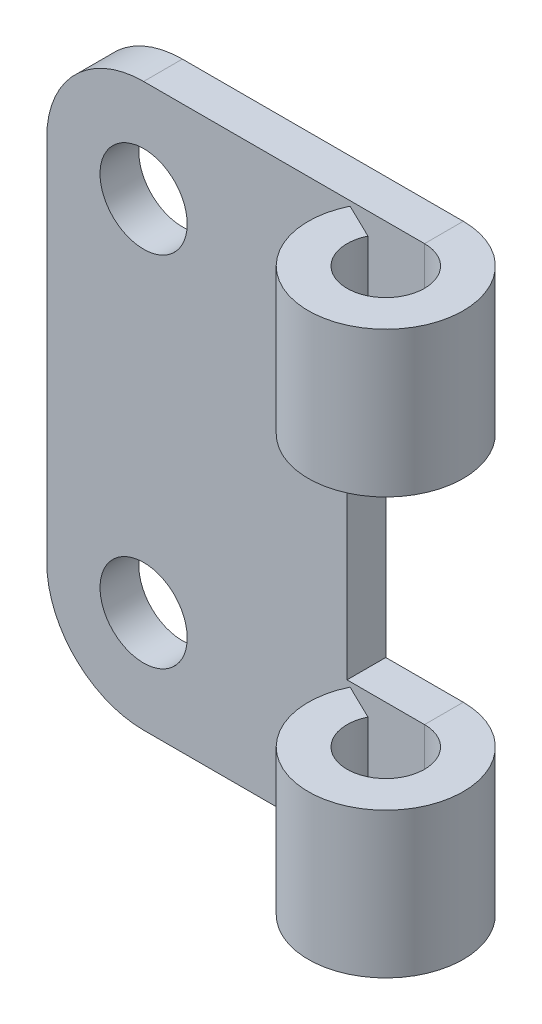
ISO-10303-21;
HEADER;
FILE_DESCRIPTION(('STEP AP214'),'2;1');
FILE_NAME('part.step','',(''),(''),'','','');
FILE_SCHEMA(('AUTOMOTIVE_DESIGN { 1 0 10303 214 1 1 1 1 }'));
ENDSEC;
DATA;
#1=APPLICATION_CONTEXT('core data for automotive mechanical design processes');
#2=APPLICATION_PROTOCOL_DEFINITION('international standard','automotive_design',2000,#1);
#3=PRODUCT_CONTEXT('',#1,'mechanical');
#4=PRODUCT('Part','Part','',(#3));
#5=PRODUCT_RELATED_PRODUCT_CATEGORY('part','',(#4));
#6=PRODUCT_DEFINITION_FORMATION('','',#4);
#7=PRODUCT_DEFINITION_CONTEXT('part definition',#1,'design');
#8=PRODUCT_DEFINITION('design','',#6,#7);
#9=PRODUCT_DEFINITION_SHAPE('','',#8);
#10=(LENGTH_UNIT() NAMED_UNIT(*) SI_UNIT(.MILLI.,.METRE.));
#11=(NAMED_UNIT(*) PLANE_ANGLE_UNIT() SI_UNIT($,.RADIAN.));
#12=(NAMED_UNIT(*) SI_UNIT($,.STERADIAN.) SOLID_ANGLE_UNIT());
#13=UNCERTAINTY_MEASURE_WITH_UNIT(LENGTH_MEASURE(1.E-05),#10,'distance_accuracy_value','');
#14=(GEOMETRIC_REPRESENTATION_CONTEXT(3) GLOBAL_UNCERTAINTY_ASSIGNED_CONTEXT((#13)) GLOBAL_UNIT_ASSIGNED_CONTEXT((#10,
#11,#12)) REPRESENTATION_CONTEXT('',''));
#15=CARTESIAN_POINT('',(0.,0.,0.));
#16=DIRECTION('',(0.,0.,1.));
#17=DIRECTION('',(1.,0.,0.));
#18=AXIS2_PLACEMENT_3D('',#15,#16,#17);
#19=CARTESIAN_POINT('',(-19.5,-29.,-4.));
#20=DIRECTION('',(0.,-1.,0.));
#21=DIRECTION('',(0.,0.,-1.));
#22=AXIS2_PLACEMENT_3D('',#19,#20,#21);
#23=PLANE('',#22);
#24=DIRECTION('',(1.,0.,0.));
#25=VECTOR('',#24,1.);
#26=CARTESIAN_POINT('',(-19.5,-29.,0.));
#27=LINE('',#26,#25);
#28=CARTESIAN_POINT('',(-9.50000000000001,-29.,0.));
#29=VERTEX_POINT('',#28);
#30=CARTESIAN_POINT('',(19.5,-29.,0.));
#31=VERTEX_POINT('',#30);
#32=EDGE_CURVE('E204',#29,#31,#27,.T.);
#33=ORIENTED_EDGE('',*,*,#32,.F.);
#34=DIRECTION('',(0.,0.,1.));
#35=VECTOR('',#34,1.);
#36=CARTESIAN_POINT('',(-9.50000000000001,-29.,-4.));
#37=LINE('',#36,#35);
#38=CARTESIAN_POINT('',(-9.50000000000001,-29.,-4.));
#39=VERTEX_POINT('',#38);
#40=EDGE_CURVE('E59',#29,#39,#37,.F.);
#41=ORIENTED_EDGE('',*,*,#40,.T.);
#42=DIRECTION('',(1.,0.,0.));
#43=VECTOR('',#42,1.);
#44=CARTESIAN_POINT('',(-19.5,-29.,-4.));
#45=LINE('',#44,#43);
#46=CARTESIAN_POINT('',(19.5,-29.,-4.));
#47=VERTEX_POINT('',#46);
#48=EDGE_CURVE('E221',#39,#47,#45,.T.);
#49=ORIENTED_EDGE('',*,*,#48,.T.);
#50=DIRECTION('',(0.,0.,1.));
#51=VECTOR('',#50,1.);
#52=CARTESIAN_POINT('',(19.5,-29.,-4.));
#53=LINE('',#52,#51);
#54=EDGE_CURVE('E165',#47,#31,#53,.T.);
#55=ORIENTED_EDGE('',*,*,#54,.T.);
#56=EDGE_LOOP('',(#33,#41,#49,#55));
#57=FACE_BOUND('',#56,.T.);
#58=ADVANCED_FACE('F36',(#57),#23,.T.);
#59=CARTESIAN_POINT('',(-19.5,29.,-4.));
#60=DIRECTION('',(-1.,0.,0.));
#61=DIRECTION('',(0.,-1.,0.));
#62=AXIS2_PLACEMENT_3D('',#59,#60,#61);
#63=PLANE('',#62);
#64=DIRECTION('',(0.,-1.,0.));
#65=VECTOR('',#64,1.);
#66=CARTESIAN_POINT('',(-19.5,29.,-4.));
#67=LINE('',#66,#65);
#68=CARTESIAN_POINT('',(-19.5,19.,-4.));
#69=VERTEX_POINT('',#68);
#70=CARTESIAN_POINT('',(-19.5,-19.,-4.));
#71=VERTEX_POINT('',#70);
#72=EDGE_CURVE('E218',#69,#71,#67,.T.);
#73=ORIENTED_EDGE('',*,*,#72,.T.);
#74=DIRECTION('',(0.,0.,1.));
#75=VECTOR('',#74,1.);
#76=CARTESIAN_POINT('',(-19.5,-19.,-4.));
#77=LINE('',#76,#75);
#78=CARTESIAN_POINT('',(-19.5,-19.,0.));
#79=VERTEX_POINT('',#78);
#80=EDGE_CURVE('E257',#71,#79,#77,.T.);
#81=ORIENTED_EDGE('',*,*,#80,.T.);
#82=DIRECTION('',(0.,-1.,0.));
#83=VECTOR('',#82,1.);
#84=CARTESIAN_POINT('',(-19.5,29.,0.));
#85=LINE('',#84,#83);
#86=CARTESIAN_POINT('',(-19.5,19.,0.));
#87=VERTEX_POINT('',#86);
#88=EDGE_CURVE('E239',#87,#79,#85,.T.);
#89=ORIENTED_EDGE('',*,*,#88,.F.);
#90=DIRECTION('',(0.,0.,1.));
#91=VECTOR('',#90,1.);
#92=CARTESIAN_POINT('',(-19.5,19.,-4.));
#93=LINE('',#92,#91);
#94=EDGE_CURVE('E244',#87,#69,#93,.F.);
#95=ORIENTED_EDGE('',*,*,#94,.T.);
#96=EDGE_LOOP('',(#73,#81,#89,#95));
#97=FACE_BOUND('',#96,.T.);
#98=ADVANCED_FACE('F271',(#97),#63,.T.);
#99=CARTESIAN_POINT('',(-19.5,29.,-4.));
#100=DIRECTION('',(0.,1.,0.));
#101=DIRECTION('',(0.,0.,1.));
#102=AXIS2_PLACEMENT_3D('',#99,#100,#101);
#103=PLANE('',#102);
#104=DIRECTION('',(-1.,0.,0.));
#105=VECTOR('',#104,1.);
#106=CARTESIAN_POINT('',(-19.5,29.,-4.));
#107=LINE('',#106,#105);
#108=CARTESIAN_POINT('',(19.5,29.,-4.));
#109=VERTEX_POINT('',#108);
#110=CARTESIAN_POINT('',(-9.50000000000001,29.,-4.));
#111=VERTEX_POINT('',#110);
#112=EDGE_CURVE('E216',#109,#111,#107,.T.);
#113=ORIENTED_EDGE('',*,*,#112,.T.);
#114=DIRECTION('',(0.,0.,1.));
#115=VECTOR('',#114,1.);
#116=CARTESIAN_POINT('',(-9.50000000000001,29.,-4.));
#117=LINE('',#116,#115);
#118=CARTESIAN_POINT('',(-9.50000000000001,29.,0.));
#119=VERTEX_POINT('',#118);
#120=EDGE_CURVE('E11',#111,#119,#117,.T.);
#121=ORIENTED_EDGE('',*,*,#120,.T.);
#122=DIRECTION('',(-1.,0.,0.));
#123=VECTOR('',#122,1.);
#124=CARTESIAN_POINT('',(-19.5,29.,0.));
#125=LINE('',#124,#123);
#126=CARTESIAN_POINT('',(19.5,29.,0.));
#127=VERTEX_POINT('',#126);
#128=EDGE_CURVE('E236',#127,#119,#125,.T.);
#129=ORIENTED_EDGE('',*,*,#128,.F.);
#130=DIRECTION('',(0.,0.,1.));
#131=VECTOR('',#130,1.);
#132=CARTESIAN_POINT('',(19.5,29.,-4.));
#133=LINE('',#132,#131);
#134=EDGE_CURVE('E245',#109,#127,#133,.T.);
#135=ORIENTED_EDGE('',*,*,#134,.F.);
#136=EDGE_LOOP('',(#113,#121,#129,#135));
#137=FACE_BOUND('',#136,.T.);
#138=ADVANCED_FACE('F303',(#137),#103,.T.);
#139=CARTESIAN_POINT('',(19.5,14.,-4.));
#140=DIRECTION('',(0.,-1.,0.));
#141=DIRECTION('',(0.,0.,-1.));
#142=AXIS2_PLACEMENT_3D('',#139,#140,#141);
#143=PLANE('',#142);
#144=DIRECTION('',(1.,0.,0.));
#145=VECTOR('',#144,1.);
#146=CARTESIAN_POINT('',(19.5,14.,0.));
#147=LINE('',#146,#145);
#148=CARTESIAN_POINT('',(11.5,14.,0.));
#149=VERTEX_POINT('',#148);
#150=CARTESIAN_POINT('',(19.5,14.,0.));
#151=VERTEX_POINT('',#150);
#152=EDGE_CURVE('E231',#149,#151,#147,.T.);
#153=ORIENTED_EDGE('',*,*,#152,.F.);
#154=DIRECTION('',(0.,0.,1.));
#155=VECTOR('',#154,1.);
#156=CARTESIAN_POINT('',(11.5,14.,-4.));
#157=LINE('',#156,#155);
#158=CARTESIAN_POINT('',(11.5,14.,-4.));
#159=VERTEX_POINT('',#158);
#160=EDGE_CURVE('E250',#159,#149,#157,.T.);
#161=ORIENTED_EDGE('',*,*,#160,.F.);
#162=DIRECTION('',(1.,0.,0.));
#163=VECTOR('',#162,1.);
#164=CARTESIAN_POINT('',(19.5,14.,-4.));
#165=LINE('',#164,#163);
#166=CARTESIAN_POINT('',(19.5,14.,-4.));
#167=VERTEX_POINT('',#166);
#168=EDGE_CURVE('E210',#159,#167,#165,.T.);
#169=ORIENTED_EDGE('',*,*,#168,.T.);
#170=DIRECTION('',(0.,0.,1.));
#171=VECTOR('',#170,1.);
#172=CARTESIAN_POINT('',(19.5,14.,-4.));
#173=LINE('',#172,#171);
#174=EDGE_CURVE('E248',#167,#151,#173,.T.);
#175=ORIENTED_EDGE('',*,*,#174,.T.);
#176=EDGE_LOOP('',(#153,#161,#169,#175));
#177=FACE_BOUND('',#176,.T.);
#178=ADVANCED_FACE('F310',(#177),#143,.T.);
#179=CARTESIAN_POINT('',(11.5,14.,-4.));
#180=DIRECTION('',(1.,0.,0.));
#181=DIRECTION('',(0.,0.,-1.));
#182=AXIS2_PLACEMENT_3D('',#179,#180,#181);
#183=PLANE('',#182);
#184=DIRECTION('',(0.,1.,0.));
#185=VECTOR('',#184,1.);
#186=CARTESIAN_POINT('',(11.5,14.,0.));
#187=LINE('',#186,#185);
#188=CARTESIAN_POINT('',(11.5,-14.,0.));
#189=VERTEX_POINT('',#188);
#190=EDGE_CURVE('E228',#189,#149,#187,.T.);
#191=ORIENTED_EDGE('',*,*,#190,.F.);
#192=DIRECTION('',(0.,0.,1.));
#193=VECTOR('',#192,1.);
#194=CARTESIAN_POINT('',(11.5,-14.,-4.));
#195=LINE('',#194,#193);
#196=CARTESIAN_POINT('',(11.5,-14.,-4.));
#197=VERTEX_POINT('',#196);
#198=EDGE_CURVE('E252',#197,#189,#195,.T.);
#199=ORIENTED_EDGE('',*,*,#198,.F.);
#200=DIRECTION('',(0.,1.,0.));
#201=VECTOR('',#200,1.);
#202=CARTESIAN_POINT('',(11.5,14.,-4.));
#203=LINE('',#202,#201);
#204=EDGE_CURVE('E207',#197,#159,#203,.T.);
#205=ORIENTED_EDGE('',*,*,#204,.T.);
#206=ORIENTED_EDGE('',*,*,#160,.T.);
#207=EDGE_LOOP('',(#191,#199,#205,#206));
#208=FACE_BOUND('',#207,.T.);
#209=ADVANCED_FACE('F314',(#208),#183,.T.);
#210=CARTESIAN_POINT('',(11.5,-14.,-4.));
#211=DIRECTION('',(0.,1.,0.));
#212=DIRECTION('',(0.,0.,1.));
#213=AXIS2_PLACEMENT_3D('',#210,#211,#212);
#214=PLANE('',#213);
#215=DIRECTION('',(-1.,0.,0.));
#216=VECTOR('',#215,1.);
#217=CARTESIAN_POINT('',(11.5,-14.,0.));
#218=LINE('',#217,#216);
#219=CARTESIAN_POINT('',(19.5,-14.,0.));
#220=VERTEX_POINT('',#219);
#221=EDGE_CURVE('E225',#220,#189,#218,.T.);
#222=ORIENTED_EDGE('',*,*,#221,.F.);
#223=DIRECTION('',(0.,0.,1.));
#224=VECTOR('',#223,1.);
#225=CARTESIAN_POINT('',(19.5,-14.,-4.));
#226=LINE('',#225,#224);
#227=CARTESIAN_POINT('',(19.5,-14.,-4.));
#228=VERTEX_POINT('',#227);
#229=EDGE_CURVE('E223',#228,#220,#226,.T.);
#230=ORIENTED_EDGE('',*,*,#229,.F.);
#231=DIRECTION('',(-1.,0.,0.));
#232=VECTOR('',#231,1.);
#233=CARTESIAN_POINT('',(11.5,-14.,-4.));
#234=LINE('',#233,#232);
#235=EDGE_CURVE('E203',#228,#197,#234,.T.);
#236=ORIENTED_EDGE('',*,*,#235,.T.);
#237=ORIENTED_EDGE('',*,*,#198,.T.);
#238=EDGE_LOOP('',(#222,#230,#236,#237));
#239=FACE_BOUND('',#238,.T.);
#240=ADVANCED_FACE('F283',(#239),#214,.T.);
#241=CARTESIAN_POINT('',(0.,0.,-4.));
#242=DIRECTION('',(0.,0.,1.));
#243=DIRECTION('',(1.,0.,0.));
#244=AXIS2_PLACEMENT_3D('',#241,#242,#243);
#245=PLANE('',#244);
#246=CARTESIAN_POINT('',(-9.50000000000001,18.5,-4.));
#247=DIRECTION('',(0.,0.,1.));
#248=DIRECTION('',(1.,0.,0.));
#249=AXIS2_PLACEMENT_3D('',#246,#247,#248);
#250=CIRCLE('',#249,4.5);
#251=CARTESIAN_POINT('',(-5.00000000000001,18.5,-4.));
#252=VERTEX_POINT('',#251);
#253=EDGE_CURVE('E169',#252,#252,#250,.T.);
#254=ORIENTED_EDGE('',*,*,#253,.T.);
#255=EDGE_LOOP('',(#254));
#256=FACE_BOUND('',#255,.T.);
#257=CARTESIAN_POINT('',(-9.50000000000001,-18.5,-4.));
#258=DIRECTION('',(0.,0.,1.));
#259=DIRECTION('',(1.,0.,0.));
#260=AXIS2_PLACEMENT_3D('',#257,#258,#259);
#261=CIRCLE('',#260,4.5);
#262=CARTESIAN_POINT('',(-5.00000000000001,-18.5,-4.));
#263=VERTEX_POINT('',#262);
#264=EDGE_CURVE('E375',#263,#263,#261,.T.);
#265=ORIENTED_EDGE('',*,*,#264,.T.);
#266=EDGE_LOOP('',(#265));
#267=FACE_BOUND('',#266,.T.);
#268=ORIENTED_EDGE('',*,*,#48,.F.);
#269=CARTESIAN_POINT('',(-9.50000000000001,-19.,-4.));
#270=DIRECTION('',(0.,0.,1.));
#271=DIRECTION('',(1.,0.,0.));
#272=AXIS2_PLACEMENT_3D('',#269,#270,#271);
#273=CIRCLE('',#272,10.);
#274=EDGE_CURVE('E44',#39,#71,#273,.F.);
#275=ORIENTED_EDGE('',*,*,#274,.T.);
#276=ORIENTED_EDGE('',*,*,#72,.F.);
#277=CARTESIAN_POINT('',(-9.50000000000001,19.,-4.));
#278=DIRECTION('',(0.,0.,1.));
#279=DIRECTION('',(1.,0.,0.));
#280=AXIS2_PLACEMENT_3D('',#277,#278,#279);
#281=CIRCLE('',#280,10.);
#282=EDGE_CURVE('E51',#69,#111,#281,.F.);
#283=ORIENTED_EDGE('',*,*,#282,.T.);
#284=ORIENTED_EDGE('',*,*,#112,.F.);
#285=DIRECTION('',(0.,1.,0.));
#286=VECTOR('',#285,1.);
#287=CARTESIAN_POINT('',(19.5,29.,-4.));
#288=LINE('',#287,#286);
#289=EDGE_CURVE('E213',#167,#109,#288,.T.);
#290=ORIENTED_EDGE('',*,*,#289,.F.);
#291=ORIENTED_EDGE('',*,*,#168,.F.);
#292=ORIENTED_EDGE('',*,*,#204,.F.);
#293=ORIENTED_EDGE('',*,*,#235,.F.);
#294=DIRECTION('',(0.,1.,0.));
#295=VECTOR('',#294,1.);
#296=CARTESIAN_POINT('',(19.5,-14.,-4.));
#297=LINE('',#296,#295);
#298=EDGE_CURVE('E201',#47,#228,#297,.T.);
#299=ORIENTED_EDGE('',*,*,#298,.F.);
#300=EDGE_LOOP('',(#268,#275,#276,#283,#284,#290,#291,#292,#293,#299));
#301=FACE_BOUND('',#300,.T.);
#302=ADVANCED_FACE('F266',(#256,#267,#301),#245,.F.);
#303=CARTESIAN_POINT('',(0.,0.,0.));
#304=DIRECTION('',(0.,0.,1.));
#305=DIRECTION('',(1.,0.,0.));
#306=AXIS2_PLACEMENT_3D('',#303,#304,#305);
#307=PLANE('',#306);
#308=CARTESIAN_POINT('',(-9.50000000000001,18.5,0.));
#309=DIRECTION('',(0.,0.,1.));
#310=DIRECTION('',(1.,0.,0.));
#311=AXIS2_PLACEMENT_3D('',#308,#309,#310);
#312=CIRCLE('',#311,4.5);
#313=CARTESIAN_POINT('',(-5.00000000000001,18.5,0.));
#314=VERTEX_POINT('',#313);
#315=EDGE_CURVE('E377',#314,#314,#312,.T.);
#316=ORIENTED_EDGE('',*,*,#315,.F.);
#317=EDGE_LOOP('',(#316));
#318=FACE_BOUND('',#317,.T.);
#319=CARTESIAN_POINT('',(-9.50000000000001,-18.5,0.));
#320=DIRECTION('',(0.,0.,1.));
#321=DIRECTION('',(1.,0.,0.));
#322=AXIS2_PLACEMENT_3D('',#319,#320,#321);
#323=CIRCLE('',#322,4.5);
#324=CARTESIAN_POINT('',(-5.00000000000001,-18.5,0.));
#325=VERTEX_POINT('',#324);
#326=EDGE_CURVE('E378',#325,#325,#323,.T.);
#327=ORIENTED_EDGE('',*,*,#326,.F.);
#328=EDGE_LOOP('',(#327));
#329=FACE_BOUND('',#328,.T.);
#330=ORIENTED_EDGE('',*,*,#88,.T.);
#331=CARTESIAN_POINT('',(-9.50000000000001,-19.,0.));
#332=DIRECTION('',(0.,0.,1.));
#333=DIRECTION('',(1.,0.,0.));
#334=AXIS2_PLACEMENT_3D('',#331,#332,#333);
#335=CIRCLE('',#334,10.);
#336=EDGE_CURVE('E262',#79,#29,#335,.T.);
#337=ORIENTED_EDGE('',*,*,#336,.T.);
#338=ORIENTED_EDGE('',*,*,#32,.T.);
#339=DIRECTION('',(0.,1.,0.));
#340=VECTOR('',#339,1.);
#341=CARTESIAN_POINT('',(19.5,-14.,0.));
#342=LINE('',#341,#340);
#343=EDGE_CURVE('E200',#31,#220,#342,.T.);
#344=ORIENTED_EDGE('',*,*,#343,.T.);
#345=ORIENTED_EDGE('',*,*,#221,.T.);
#346=ORIENTED_EDGE('',*,*,#190,.T.);
#347=ORIENTED_EDGE('',*,*,#152,.T.);
#348=DIRECTION('',(0.,1.,0.));
#349=VECTOR('',#348,1.);
#350=CARTESIAN_POINT('',(19.5,29.,0.));
#351=LINE('',#350,#349);
#352=EDGE_CURVE('E234',#151,#127,#351,.T.);
#353=ORIENTED_EDGE('',*,*,#352,.T.);
#354=ORIENTED_EDGE('',*,*,#128,.T.);
#355=CARTESIAN_POINT('',(-9.50000000000001,19.,0.));
#356=DIRECTION('',(0.,0.,1.));
#357=DIRECTION('',(1.,0.,0.));
#358=AXIS2_PLACEMENT_3D('',#355,#356,#357);
#359=CIRCLE('',#358,10.);
#360=EDGE_CURVE('E260',#119,#87,#359,.T.);
#361=ORIENTED_EDGE('',*,*,#360,.T.);
#362=EDGE_LOOP('',(#330,#337,#338,#344,#345,#346,#347,#353,#354,#361));
#363=FACE_BOUND('',#362,.T.);
#364=ADVANCED_FACE('F276',(#318,#329,#363),#307,.T.);
#365=CARTESIAN_POINT('',(15.9048238148033,21.5,2.24651541284364));
#366=DIRECTION('',(-0.43837114678909,0.,0.898794046299161));
#367=DIRECTION('',(0.,1.,0.));
#368=AXIS2_PLACEMENT_3D('',#365,#366,#367);
#369=PLANE('',#368);
#370=DIRECTION('',(-0.898794046299161,0.,-0.43837114678909));
#371=VECTOR('',#370,1.);
#372=CARTESIAN_POINT('',(15.9048238148033,29.,2.24651541284364));
#373=LINE('',#372,#371);
#374=CARTESIAN_POINT('',(15.9048238148033,29.,2.24651541284364));
#375=VERTEX_POINT('',#374);
#376=CARTESIAN_POINT('',(12.3096476296067,29.,0.493030825687277));
#377=VERTEX_POINT('',#376);
#378=EDGE_CURVE('E198',#375,#377,#373,.T.);
#379=ORIENTED_EDGE('',*,*,#378,.F.);
#380=DIRECTION('',(0.,1.,0.));
#381=VECTOR('',#380,1.);
#382=CARTESIAN_POINT('',(15.9048238148033,29.,2.24651541284364));
#383=LINE('',#382,#381);
#384=CARTESIAN_POINT('',(15.9048238148033,14.,2.24651541284364));
#385=VERTEX_POINT('',#384);
#386=EDGE_CURVE('E178',#385,#375,#383,.T.);
#387=ORIENTED_EDGE('',*,*,#386,.F.);
#388=DIRECTION('',(-0.898794046299161,0.,-0.43837114678909));
#389=VECTOR('',#388,1.);
#390=CARTESIAN_POINT('',(15.9048238148033,14.,2.24651541284364));
#391=LINE('',#390,#389);
#392=CARTESIAN_POINT('',(12.3096476296067,14.,0.493030825687277));
#393=VERTEX_POINT('',#392);
#394=EDGE_CURVE('E182',#385,#393,#391,.T.);
#395=ORIENTED_EDGE('',*,*,#394,.T.);
#396=DIRECTION('',(0.,1.,0.));
#397=VECTOR('',#396,1.);
#398=CARTESIAN_POINT('',(12.3096476296067,29.,0.493030825687277));
#399=LINE('',#398,#397);
#400=EDGE_CURVE('E184',#393,#377,#399,.T.);
#401=ORIENTED_EDGE('',*,*,#400,.T.);
#402=EDGE_LOOP('',(#379,#387,#395,#401));
#403=FACE_BOUND('',#402,.T.);
#404=ADVANCED_FACE('F357',(#403),#369,.F.);
#405=CARTESIAN_POINT('',(19.5,14.,4.));
#406=DIRECTION('',(0.,-1.,0.));
#407=DIRECTION('',(0.,0.,-1.));
#408=AXIS2_PLACEMENT_3D('',#405,#406,#407);
#409=PLANE('',#408);
#410=ORIENTED_EDGE('',*,*,#394,.F.);
#411=CARTESIAN_POINT('',(19.5,14.,4.));
#412=DIRECTION('',(0.,1.,0.));
#413=DIRECTION('',(0.,0.,1.));
#414=AXIS2_PLACEMENT_3D('',#411,#412,#413);
#415=CIRCLE('',#414,4.);
#416=EDGE_CURVE('E187',#151,#385,#415,.F.);
#417=ORIENTED_EDGE('',*,*,#416,.F.);
#418=ORIENTED_EDGE('',*,*,#174,.F.);
#419=CARTESIAN_POINT('',(19.5,14.,4.));
#420=DIRECTION('',(0.,1.,0.));
#421=DIRECTION('',(0.,0.,1.));
#422=AXIS2_PLACEMENT_3D('',#419,#420,#421);
#423=CIRCLE('',#422,8.);
#424=EDGE_CURVE('E179',#167,#393,#423,.F.);
#425=ORIENTED_EDGE('',*,*,#424,.T.);
#426=EDGE_LOOP('',(#410,#417,#418,#425));
#427=FACE_BOUND('',#426,.T.);
#428=ADVANCED_FACE('F354',(#427),#409,.T.);
#429=CARTESIAN_POINT('',(19.5,29.,4.));
#430=DIRECTION('',(0.,-1.,0.));
#431=DIRECTION('',(0.,0.,-1.));
#432=AXIS2_PLACEMENT_3D('',#429,#430,#431);
#433=PLANE('',#432);
#434=CARTESIAN_POINT('',(19.5,29.,4.));
#435=DIRECTION('',(0.,1.,0.));
#436=DIRECTION('',(0.,0.,1.));
#437=AXIS2_PLACEMENT_3D('',#434,#435,#436);
#438=CIRCLE('',#437,4.);
#439=EDGE_CURVE('E192',#375,#127,#438,.T.);
#440=ORIENTED_EDGE('',*,*,#439,.F.);
#441=ORIENTED_EDGE('',*,*,#378,.T.);
#442=CARTESIAN_POINT('',(19.5,29.,4.));
#443=DIRECTION('',(0.,1.,0.));
#444=DIRECTION('',(0.,0.,1.));
#445=AXIS2_PLACEMENT_3D('',#442,#443,#444);
#446=CIRCLE('',#445,8.);
#447=EDGE_CURVE('E183',#377,#109,#446,.T.);
#448=ORIENTED_EDGE('',*,*,#447,.T.);
#449=ORIENTED_EDGE('',*,*,#134,.T.);
#450=EDGE_LOOP('',(#440,#441,#448,#449));
#451=FACE_BOUND('',#450,.T.);
#452=ADVANCED_FACE('F350',(#451),#433,.F.);
#453=CARTESIAN_POINT('',(19.5,29.,4.));
#454=DIRECTION('',(0.,1.,0.));
#455=DIRECTION('',(-0.898794046299161,0.,-0.43837114678909));
#456=AXIS2_PLACEMENT_3D('',#453,#454,#455);
#457=CYLINDRICAL_SURFACE('',#456,8.);
#458=ORIENTED_EDGE('',*,*,#289,.T.);
#459=ORIENTED_EDGE('',*,*,#447,.F.);
#460=ORIENTED_EDGE('',*,*,#400,.F.);
#461=ORIENTED_EDGE('',*,*,#424,.F.);
#462=EDGE_LOOP('',(#458,#459,#460,#461));
#463=FACE_BOUND('',#462,.T.);
#464=ADVANCED_FACE('F344',(#463),#457,.T.);
#465=CARTESIAN_POINT('',(19.5,29.,4.));
#466=DIRECTION('',(0.,1.,0.));
#467=DIRECTION('',(-0.898794046299161,0.,-0.43837114678909));
#468=AXIS2_PLACEMENT_3D('',#465,#466,#467);
#469=CYLINDRICAL_SURFACE('',#468,4.);
#470=ORIENTED_EDGE('',*,*,#352,.F.);
#471=ORIENTED_EDGE('',*,*,#416,.T.);
#472=ORIENTED_EDGE('',*,*,#386,.T.);
#473=ORIENTED_EDGE('',*,*,#439,.T.);
#474=EDGE_LOOP('',(#470,#471,#472,#473));
#475=FACE_BOUND('',#474,.T.);
#476=ADVANCED_FACE('F340',(#475),#469,.F.);
#477=CARTESIAN_POINT('',(15.9048238148033,-21.5,2.24651541284364));
#478=DIRECTION('',(-0.43837114678909,0.,0.898794046299161));
#479=DIRECTION('',(0.,1.,0.));
#480=AXIS2_PLACEMENT_3D('',#477,#478,#479);
#481=PLANE('',#480);
#482=DIRECTION('',(-0.898794046299161,0.,-0.43837114678909));
#483=VECTOR('',#482,1.);
#484=CARTESIAN_POINT('',(15.9048238148033,-14.,2.24651541284364));
#485=LINE('',#484,#483);
#486=CARTESIAN_POINT('',(15.9048238148033,-14.,2.24651541284364));
#487=VERTEX_POINT('',#486);
#488=CARTESIAN_POINT('',(12.3096476296067,-14.,0.493030825687278));
#489=VERTEX_POINT('',#488);
#490=EDGE_CURVE('E150',#487,#489,#485,.T.);
#491=ORIENTED_EDGE('',*,*,#490,.F.);
#492=DIRECTION('',(0.,1.,0.));
#493=VECTOR('',#492,1.);
#494=CARTESIAN_POINT('',(15.9048238148033,-14.,2.24651541284364));
#495=LINE('',#494,#493);
#496=CARTESIAN_POINT('',(15.9048238148034,-29.,2.24651541284364));
#497=VERTEX_POINT('',#496);
#498=EDGE_CURVE('E145',#497,#487,#495,.T.);
#499=ORIENTED_EDGE('',*,*,#498,.F.);
#500=DIRECTION('',(-0.898794046299161,0.,-0.43837114678909));
#501=VECTOR('',#500,1.);
#502=CARTESIAN_POINT('',(15.9048238148034,-29.,2.24651541284364));
#503=LINE('',#502,#501);
#504=CARTESIAN_POINT('',(12.3096476296067,-29.,0.493030825687278));
#505=VERTEX_POINT('',#504);
#506=EDGE_CURVE('E140',#497,#505,#503,.T.);
#507=ORIENTED_EDGE('',*,*,#506,.T.);
#508=DIRECTION('',(0.,1.,0.));
#509=VECTOR('',#508,1.);
#510=CARTESIAN_POINT('',(12.3096476296067,-14.,0.493030825687278));
#511=LINE('',#510,#509);
#512=EDGE_CURVE('E143',#505,#489,#511,.T.);
#513=ORIENTED_EDGE('',*,*,#512,.T.);
#514=EDGE_LOOP('',(#491,#499,#507,#513));
#515=FACE_BOUND('',#514,.T.);
#516=ADVANCED_FACE('F142',(#515),#481,.F.);
#517=CARTESIAN_POINT('',(19.5,-29.,4.));
#518=DIRECTION('',(0.,-1.,0.));
#519=DIRECTION('',(1.,0.,0.));
#520=AXIS2_PLACEMENT_3D('',#517,#518,#519);
#521=PLANE('',#520);
#522=ORIENTED_EDGE('',*,*,#506,.F.);
#523=CARTESIAN_POINT('',(19.5,-29.,4.));
#524=DIRECTION('',(0.,1.,0.));
#525=DIRECTION('',(-1.,0.,0.));
#526=AXIS2_PLACEMENT_3D('',#523,#524,#525);
#527=CIRCLE('',#526,4.);
#528=EDGE_CURVE('E160',#31,#497,#527,.F.);
#529=ORIENTED_EDGE('',*,*,#528,.F.);
#530=ORIENTED_EDGE('',*,*,#54,.F.);
#531=CARTESIAN_POINT('',(19.5,-29.,4.));
#532=DIRECTION('',(0.,1.,0.));
#533=DIRECTION('',(-1.,0.,0.));
#534=AXIS2_PLACEMENT_3D('',#531,#532,#533);
#535=CIRCLE('',#534,8.);
#536=EDGE_CURVE('E151',#47,#505,#535,.F.);
#537=ORIENTED_EDGE('',*,*,#536,.T.);
#538=EDGE_LOOP('',(#522,#529,#530,#537));
#539=FACE_BOUND('',#538,.T.);
#540=ADVANCED_FACE('F163',(#539),#521,.T.);
#541=CARTESIAN_POINT('',(19.5,-14.,4.));
#542=DIRECTION('',(0.,-1.,0.));
#543=DIRECTION('',(1.,0.,0.));
#544=AXIS2_PLACEMENT_3D('',#541,#542,#543);
#545=PLANE('',#544);
#546=CARTESIAN_POINT('',(19.5,-14.,4.));
#547=DIRECTION('',(0.,1.,0.));
#548=DIRECTION('',(-1.,0.,0.));
#549=AXIS2_PLACEMENT_3D('',#546,#547,#548);
#550=CIRCLE('',#549,4.);
#551=EDGE_CURVE('E173',#487,#220,#550,.T.);
#552=ORIENTED_EDGE('',*,*,#551,.F.);
#553=ORIENTED_EDGE('',*,*,#490,.T.);
#554=CARTESIAN_POINT('',(19.5,-14.,4.));
#555=DIRECTION('',(0.,1.,0.));
#556=DIRECTION('',(-1.,0.,0.));
#557=AXIS2_PLACEMENT_3D('',#554,#555,#556);
#558=CIRCLE('',#557,8.);
#559=EDGE_CURVE('E159',#489,#228,#558,.T.);
#560=ORIENTED_EDGE('',*,*,#559,.T.);
#561=ORIENTED_EDGE('',*,*,#229,.T.);
#562=EDGE_LOOP('',(#552,#553,#560,#561));
#563=FACE_BOUND('',#562,.T.);
#564=ADVANCED_FACE('F287',(#563),#545,.F.);
#565=CARTESIAN_POINT('',(19.5,-14.,4.));
#566=DIRECTION('',(0.,1.,0.));
#567=DIRECTION('',(-0.898794046299161,0.,-0.43837114678909));
#568=AXIS2_PLACEMENT_3D('',#565,#566,#567);
#569=CYLINDRICAL_SURFACE('',#568,8.);
#570=ORIENTED_EDGE('',*,*,#298,.T.);
#571=ORIENTED_EDGE('',*,*,#559,.F.);
#572=ORIENTED_EDGE('',*,*,#512,.F.);
#573=ORIENTED_EDGE('',*,*,#536,.F.);
#574=EDGE_LOOP('',(#570,#571,#572,#573));
#575=FACE_BOUND('',#574,.T.);
#576=ADVANCED_FACE('F157',(#575),#569,.T.);
#577=CARTESIAN_POINT('',(19.5,-14.,4.));
#578=DIRECTION('',(0.,1.,0.));
#579=DIRECTION('',(-0.898794046299161,0.,-0.43837114678909));
#580=AXIS2_PLACEMENT_3D('',#577,#578,#579);
#581=CYLINDRICAL_SURFACE('',#580,4.);
#582=ORIENTED_EDGE('',*,*,#343,.F.);
#583=ORIENTED_EDGE('',*,*,#528,.T.);
#584=ORIENTED_EDGE('',*,*,#498,.T.);
#585=ORIENTED_EDGE('',*,*,#551,.T.);
#586=EDGE_LOOP('',(#582,#583,#584,#585));
#587=FACE_BOUND('',#586,.T.);
#588=ADVANCED_FACE('F279',(#587),#581,.F.);
#589=CARTESIAN_POINT('',(-9.50000000000001,-18.5,-10.));
#590=DIRECTION('',(0.,0.,1.));
#591=DIRECTION('',(1.,0.,0.));
#592=AXIS2_PLACEMENT_3D('',#589,#590,#591);
#593=CYLINDRICAL_SURFACE('',#592,4.5);
#594=ORIENTED_EDGE('',*,*,#326,.T.);
#595=EDGE_LOOP('',(#594));
#596=FACE_BOUND('',#595,.T.);
#597=ORIENTED_EDGE('',*,*,#264,.F.);
#598=EDGE_LOOP('',(#597));
#599=FACE_BOUND('',#598,.T.);
#600=ADVANCED_FACE('F327',(#596,#599),#593,.F.);
#601=CARTESIAN_POINT('',(-9.50000000000001,18.5,-10.));
#602=DIRECTION('',(0.,0.,1.));
#603=DIRECTION('',(1.,0.,0.));
#604=AXIS2_PLACEMENT_3D('',#601,#602,#603);
#605=CYLINDRICAL_SURFACE('',#604,4.5);
#606=ORIENTED_EDGE('',*,*,#315,.T.);
#607=EDGE_LOOP('',(#606));
#608=FACE_BOUND('',#607,.T.);
#609=ORIENTED_EDGE('',*,*,#253,.F.);
#610=EDGE_LOOP('',(#609));
#611=FACE_BOUND('',#610,.T.);
#612=ADVANCED_FACE('F321',(#608,#611),#605,.F.);
#613=CARTESIAN_POINT('',(-9.50000000000001,-19.,-4.));
#614=DIRECTION('',(0.,0.,1.));
#615=DIRECTION('',(1.,0.,0.));
#616=AXIS2_PLACEMENT_3D('',#613,#614,#615);
#617=CYLINDRICAL_SURFACE('',#616,10.);
#618=ORIENTED_EDGE('',*,*,#274,.F.);
#619=ORIENTED_EDGE('',*,*,#40,.F.);
#620=ORIENTED_EDGE('',*,*,#336,.F.);
#621=ORIENTED_EDGE('',*,*,#80,.F.);
#622=EDGE_LOOP('',(#618,#619,#620,#621));
#623=FACE_BOUND('',#622,.T.);
#624=ADVANCED_FACE('F274',(#623),#617,.T.);
#625=CARTESIAN_POINT('',(-9.50000000000001,19.,-4.));
#626=DIRECTION('',(0.,0.,1.));
#627=DIRECTION('',(1.,0.,0.));
#628=AXIS2_PLACEMENT_3D('',#625,#626,#627);
#629=CYLINDRICAL_SURFACE('',#628,10.);
#630=ORIENTED_EDGE('',*,*,#282,.F.);
#631=ORIENTED_EDGE('',*,*,#94,.F.);
#632=ORIENTED_EDGE('',*,*,#360,.F.);
#633=ORIENTED_EDGE('',*,*,#120,.F.);
#634=EDGE_LOOP('',(#630,#631,#632,#633));
#635=FACE_BOUND('',#634,.T.);
#636=ADVANCED_FACE('F38',(#635),#629,.T.);
#637=CLOSED_SHELL('',(#58,#98,#138,#178,#209,#240,#302,#364,#404,#428,#452,#464,#476,#516,#540,
#564,#576,#588,#600,#612,#624,#636));
#638=MANIFOLD_SOLID_BREP('B2',#637);
#639=ADVANCED_BREP_SHAPE_REPRESENTATION('',(#18,#638),#14);
#640=SHAPE_DEFINITION_REPRESENTATION(#9,#639);
ENDSEC;
END-ISO-10303-21;
